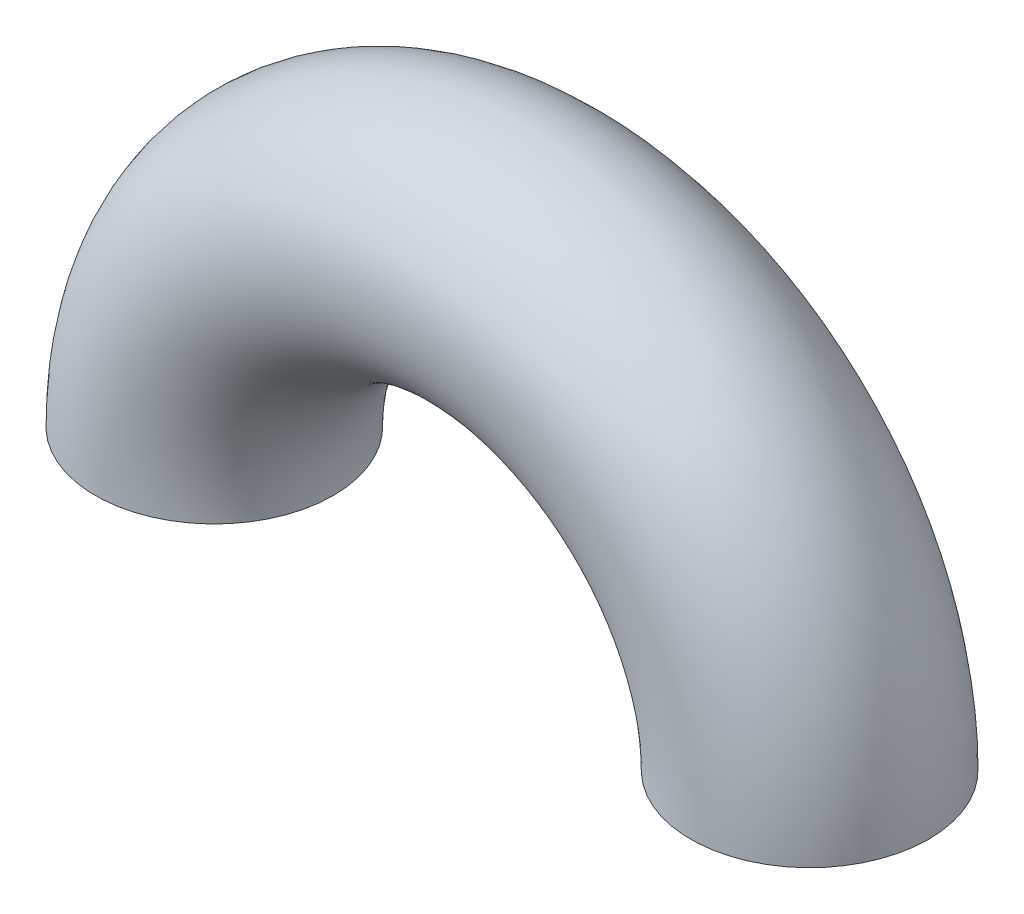
ISO-10303-21;
HEADER;
FILE_DESCRIPTION(('STEP AP214'),'2;1');
FILE_NAME('part.step','',(''),(''),'','','');
FILE_SCHEMA(('AUTOMOTIVE_DESIGN { 1 0 10303 214 1 1 1 1 }'));
ENDSEC;
DATA;
#1=APPLICATION_CONTEXT('core data for automotive mechanical design processes');
#2=APPLICATION_PROTOCOL_DEFINITION('international standard','automotive_design',2000,#1);
#3=PRODUCT_CONTEXT('',#1,'mechanical');
#4=PRODUCT('Part','Part','',(#3));
#5=PRODUCT_RELATED_PRODUCT_CATEGORY('part','',(#4));
#6=PRODUCT_DEFINITION_FORMATION('','',#4);
#7=PRODUCT_DEFINITION_CONTEXT('part definition',#1,'design');
#8=PRODUCT_DEFINITION('design','',#6,#7);
#9=PRODUCT_DEFINITION_SHAPE('','',#8);
#10=(LENGTH_UNIT() NAMED_UNIT(*) SI_UNIT(.MILLI.,.METRE.));
#11=(NAMED_UNIT(*) PLANE_ANGLE_UNIT() SI_UNIT($,.RADIAN.));
#12=(NAMED_UNIT(*) SI_UNIT($,.STERADIAN.) SOLID_ANGLE_UNIT());
#13=UNCERTAINTY_MEASURE_WITH_UNIT(LENGTH_MEASURE(1.E-05),#10,'distance_accuracy_value','');
#14=(GEOMETRIC_REPRESENTATION_CONTEXT(3) GLOBAL_UNCERTAINTY_ASSIGNED_CONTEXT((#13)) GLOBAL_UNIT_ASSIGNED_CONTEXT((#10,
#11,#12)) REPRESENTATION_CONTEXT('',''));
#15=CARTESIAN_POINT('',(0.,0.,0.));
#16=DIRECTION('',(0.,0.,1.));
#17=DIRECTION('',(1.,0.,0.));
#18=AXIS2_PLACEMENT_3D('',#15,#16,#17);
#19=CARTESIAN_POINT('',(0.,0.,0.));
#20=DIRECTION('',(0.,1.,0.));
#21=DIRECTION('',(0.,0.,1.));
#22=AXIS2_PLACEMENT_3D('',#19,#20,#21);
#23=PLANE('',#22);
#24=CARTESIAN_POINT('',(0.,0.,0.));
#25=DIRECTION('',(0.,1.,0.));
#26=DIRECTION('',(0.,0.,1.));
#27=AXIS2_PLACEMENT_3D('',#24,#25,#26);
#28=CIRCLE('',#27,4.5);
#29=CARTESIAN_POINT('',(-4.5,0.,0.));
#30=VERTEX_POINT('',#29);
#31=EDGE_CURVE('E44',#30,#30,#28,.T.);
#32=ORIENTED_EDGE('',*,*,#31,.T.);
#33=EDGE_LOOP('',(#32));
#34=FACE_BOUND('',#33,.T.);
#35=CARTESIAN_POINT('',(0.,0.,0.));
#36=DIRECTION('',(0.,1.,0.));
#37=DIRECTION('',(0.,0.,1.));
#38=AXIS2_PLACEMENT_3D('',#35,#36,#37);
#39=CIRCLE('',#38,5.);
#40=CARTESIAN_POINT('',(-5.,0.,0.));
#41=VERTEX_POINT('',#40);
#42=EDGE_CURVE('E36',#41,#41,#39,.T.);
#43=ORIENTED_EDGE('',*,*,#42,.F.);
#44=EDGE_LOOP('',(#43));
#45=FACE_BOUND('',#44,.T.);
#46=ADVANCED_FACE('F30',(#34,#45),#23,.F.);
#47=CARTESIAN_POINT('',(25.,0.,0.));
#48=DIRECTION('',(0.,-1.,0.));
#49=DIRECTION('',(0.,0.,1.));
#50=AXIS2_PLACEMENT_3D('',#47,#48,#49);
#51=PLANE('',#50);
#52=CARTESIAN_POINT('',(25.,0.,0.));
#53=DIRECTION('',(0.,-1.,0.));
#54=DIRECTION('',(1.,0.,0.));
#55=AXIS2_PLACEMENT_3D('',#52,#53,#54);
#56=CIRCLE('',#55,4.5);
#57=CARTESIAN_POINT('',(29.5,0.,0.));
#58=VERTEX_POINT('',#57);
#59=EDGE_CURVE('E40',#58,#58,#56,.T.);
#60=ORIENTED_EDGE('',*,*,#59,.F.);
#61=EDGE_LOOP('',(#60));
#62=FACE_BOUND('',#61,.T.);
#63=CARTESIAN_POINT('',(25.,0.,0.));
#64=DIRECTION('',(0.,-1.,0.));
#65=DIRECTION('',(0.,0.,1.));
#66=AXIS2_PLACEMENT_3D('',#63,#64,#65);
#67=CIRCLE('',#66,5.);
#68=CARTESIAN_POINT('',(30.,0.,0.));
#69=VERTEX_POINT('',#68);
#70=EDGE_CURVE('E10',#69,#69,#67,.T.);
#71=ORIENTED_EDGE('',*,*,#70,.T.);
#72=EDGE_LOOP('',(#71));
#73=FACE_BOUND('',#72,.T.);
#74=ADVANCED_FACE('F60',(#62,#73),#51,.T.);
#75=CARTESIAN_POINT('',(12.5,0.,0.));
#76=DIRECTION('',(0.,0.,-1.));
#77=DIRECTION('',(-1.,0.,0.));
#78=AXIS2_PLACEMENT_3D('',#75,#76,#77);
#79=TOROIDAL_SURFACE('',#78,12.5,5.);
#80=CARTESIAN_POINT('',(12.5,0.,0.));
#81=DIRECTION('',(0.,0.,-1.));
#82=DIRECTION('',(-1.,0.,0.));
#83=AXIS2_PLACEMENT_3D('',#80,#81,#82);
#84=CIRCLE('',#83,17.5);
#85=EDGE_CURVE('',#41,#69,#84,.T.);
#86=ORIENTED_EDGE('',*,*,#42,.T.);
#87=ORIENTED_EDGE('',*,*,#70,.F.);
#88=ORIENTED_EDGE('',*,*,#85,.T.);
#89=ORIENTED_EDGE('',*,*,#85,.F.);
#90=EDGE_LOOP('',(#86,#88,#87,#89));
#91=FACE_BOUND('',#90,.T.);
#92=ADVANCED_FACE('F54',(#91),#79,.T.);
#93=CARTESIAN_POINT('',(12.5,0.,0.));
#94=DIRECTION('',(0.,0.,-1.));
#95=DIRECTION('',(-1.,0.,0.));
#96=AXIS2_PLACEMENT_3D('',#93,#94,#95);
#97=TOROIDAL_SURFACE('',#96,12.5,4.5);
#98=CARTESIAN_POINT('',(12.5,0.,0.));
#99=DIRECTION('',(0.,0.,-1.));
#100=DIRECTION('',(-1.,0.,0.));
#101=AXIS2_PLACEMENT_3D('',#98,#99,#100);
#102=CIRCLE('',#101,17.);
#103=EDGE_CURVE('',#30,#58,#102,.T.);
#104=ORIENTED_EDGE('',*,*,#31,.F.);
#105=ORIENTED_EDGE('',*,*,#59,.T.);
#106=ORIENTED_EDGE('',*,*,#103,.T.);
#107=ORIENTED_EDGE('',*,*,#103,.F.);
#108=EDGE_LOOP('',(#104,#106,#105,#107));
#109=FACE_BOUND('',#108,.T.);
#110=ADVANCED_FACE('F52',(#109),#97,.F.);
#111=CLOSED_SHELL('',(#46,#74,#92,#110));
#112=MANIFOLD_SOLID_BREP('B2',#111);
#113=ADVANCED_BREP_SHAPE_REPRESENTATION('',(#18,#112),#14);
#114=SHAPE_DEFINITION_REPRESENTATION(#9,#113);
ENDSEC;
END-ISO-10303-21;
